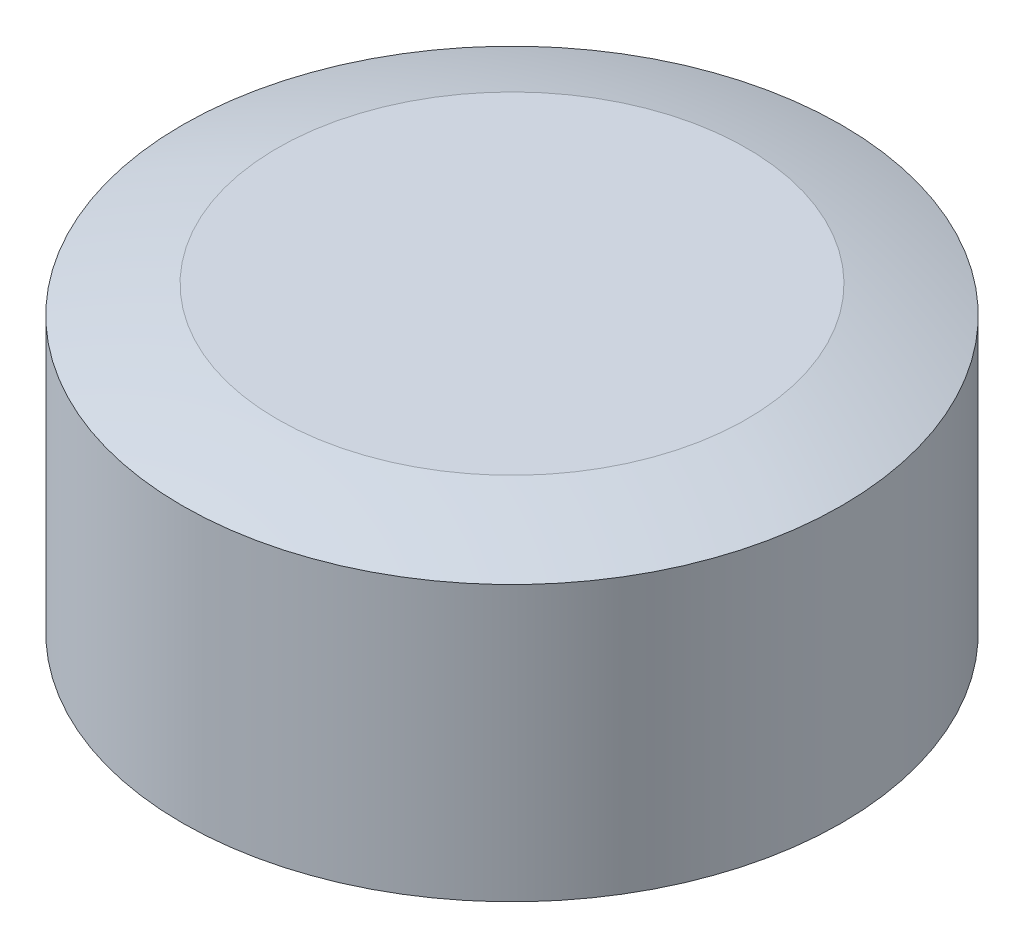
ISO-10303-21;
HEADER;
FILE_DESCRIPTION(('STEP AP214'),'2;1');
FILE_NAME('part.step','',(''),(''),'','','');
FILE_SCHEMA(('AUTOMOTIVE_DESIGN { 1 0 10303 214 1 1 1 1 }'));
ENDSEC;
DATA;
#1=APPLICATION_CONTEXT('core data for automotive mechanical design processes');
#2=APPLICATION_PROTOCOL_DEFINITION('international standard','automotive_design',2000,#1);
#3=PRODUCT_CONTEXT('',#1,'mechanical');
#4=PRODUCT('Part','Part','',(#3));
#5=PRODUCT_RELATED_PRODUCT_CATEGORY('part','',(#4));
#6=PRODUCT_DEFINITION_FORMATION('','',#4);
#7=PRODUCT_DEFINITION_CONTEXT('part definition',#1,'design');
#8=PRODUCT_DEFINITION('design','',#6,#7);
#9=PRODUCT_DEFINITION_SHAPE('','',#8);
#10=(LENGTH_UNIT() NAMED_UNIT(*) SI_UNIT(.MILLI.,.METRE.));
#11=(NAMED_UNIT(*) PLANE_ANGLE_UNIT() SI_UNIT($,.RADIAN.));
#12=(NAMED_UNIT(*) SI_UNIT($,.STERADIAN.) SOLID_ANGLE_UNIT());
#13=UNCERTAINTY_MEASURE_WITH_UNIT(LENGTH_MEASURE(1.E-05),#10,'distance_accuracy_value','');
#14=(GEOMETRIC_REPRESENTATION_CONTEXT(3) GLOBAL_UNCERTAINTY_ASSIGNED_CONTEXT((#13)) GLOBAL_UNIT_ASSIGNED_CONTEXT((#10,
#11,#12)) REPRESENTATION_CONTEXT('',''));
#15=CARTESIAN_POINT('',(0.,0.,0.));
#16=DIRECTION('',(0.,0.,1.));
#17=DIRECTION('',(1.,0.,0.));
#18=AXIS2_PLACEMENT_3D('',#15,#16,#17);
#19=CARTESIAN_POINT('',(0.,-25.,0.));
#20=DIRECTION('',(0.,0.,1.));
#21=DIRECTION('',(1.,0.,0.));
#22=AXIS2_PLACEMENT_3D('',#19,#20,#21);
#23=SPHERICAL_SURFACE('',#22,37.);
#24=CARTESIAN_POINT('',(0.,-25.,0.));
#25=DIRECTION('',(0.,1.,0.));
#26=DIRECTION('',(0.,0.,1.));
#27=AXIS2_PLACEMENT_3D('',#24,#25,#26);
#28=SPHERICAL_SURFACE('',#27,37.);
#29=CARTESIAN_POINT('',(0.,10.,0.));
#30=DIRECTION('',(0.,1.,0.));
#31=DIRECTION('',(0.,0.,1.));
#32=AXIS2_PLACEMENT_3D('',#29,#30,#31);
#33=CIRCLE('',#32,12.);
#34=CARTESIAN_POINT('',(0.,10.,12.));
#35=VERTEX_POINT('',#34);
#36=EDGE_CURVE('E10',#35,#35,#33,.T.);
#37=ORIENTED_EDGE('',*,*,#36,.T.);
#38=EDGE_LOOP('',(#37));
#39=FACE_BOUND('',#38,.T.);
#40=CARTESIAN_POINT('',(0.,11.,0.));
#41=DIRECTION('',(0.,1.,0.));
#42=DIRECTION('',(0.,0.,1.));
#43=AXIS2_PLACEMENT_3D('',#40,#41,#42);
#44=CIRCLE('',#43,8.54400374531754);
#45=CARTESIAN_POINT('',(0.,11.,8.54400374531754));
#46=VERTEX_POINT('',#45);
#47=EDGE_CURVE('E32',#46,#46,#44,.F.);
#48=ORIENTED_EDGE('',*,*,#47,.T.);
#49=EDGE_LOOP('',(#48));
#50=FACE_BOUND('',#49,.T.);
#51=ADVANCED_FACE('F29',(#39,#50),#28,.T.);
#52=CARTESIAN_POINT('',(0.,10.,0.));
#53=DIRECTION('',(0.,-1.,0.));
#54=DIRECTION('',(0.,0.,-1.));
#55=AXIS2_PLACEMENT_3D('',#52,#53,#54);
#56=CYLINDRICAL_SURFACE('',#55,12.);
#57=ORIENTED_EDGE('',*,*,#36,.F.);
#58=EDGE_LOOP('',(#57));
#59=FACE_BOUND('',#58,.T.);
#60=CARTESIAN_POINT('',(0.,0.,0.));
#61=DIRECTION('',(0.,1.,0.));
#62=DIRECTION('',(0.,0.,1.));
#63=AXIS2_PLACEMENT_3D('',#60,#61,#62);
#64=CIRCLE('',#63,12.);
#65=CARTESIAN_POINT('',(0.,0.,12.));
#66=VERTEX_POINT('',#65);
#67=EDGE_CURVE('E36',#66,#66,#64,.T.);
#68=ORIENTED_EDGE('',*,*,#67,.T.);
#69=EDGE_LOOP('',(#68));
#70=FACE_BOUND('',#69,.T.);
#71=ADVANCED_FACE('F54',(#59,#70),#56,.T.);
#72=CARTESIAN_POINT('',(0.,0.,0.));
#73=DIRECTION('',(0.,1.,0.));
#74=DIRECTION('',(0.,0.,1.));
#75=AXIS2_PLACEMENT_3D('',#72,#73,#74);
#76=PLANE('',#75);
#77=ORIENTED_EDGE('',*,*,#67,.F.);
#78=EDGE_LOOP('',(#77));
#79=FACE_BOUND('',#78,.T.);
#80=ADVANCED_FACE('F49',(#79),#76,.F.);
#81=CARTESIAN_POINT('',(0.,11.,0.));
#82=DIRECTION('',(0.,1.,0.));
#83=DIRECTION('',(0.,0.,1.));
#84=AXIS2_PLACEMENT_3D('',#81,#82,#83);
#85=PLANE('',#84);
#86=ORIENTED_EDGE('',*,*,#47,.F.);
#87=EDGE_LOOP('',(#86));
#88=FACE_BOUND('',#87,.T.);
#89=ADVANCED_FACE('F47',(#88),#85,.T.);
#90=CLOSED_SHELL('',(#51,#71,#80,#89));
#91=MANIFOLD_SOLID_BREP('B2',#90);
#92=ADVANCED_BREP_SHAPE_REPRESENTATION('',(#18,#91),#14);
#93=SHAPE_DEFINITION_REPRESENTATION(#9,#92);
ENDSEC;
END-ISO-10303-21;
